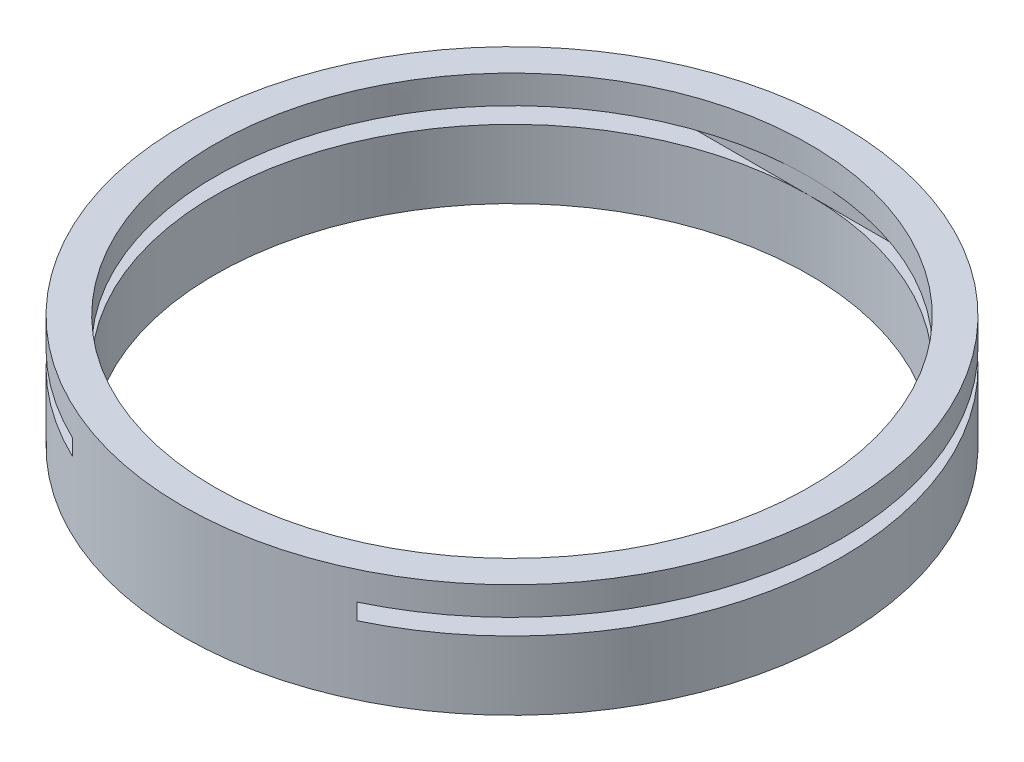
ISO-10303-21;
HEADER;
FILE_DESCRIPTION(('STEP AP214'),'2;1');
FILE_NAME('part.step','',(''),(''),'','','');
FILE_SCHEMA(('AUTOMOTIVE_DESIGN { 1 0 10303 214 1 1 1 1 }'));
ENDSEC;
DATA;
#1=APPLICATION_CONTEXT('core data for automotive mechanical design processes');
#2=APPLICATION_PROTOCOL_DEFINITION('international standard','automotive_design',2000,#1);
#3=PRODUCT_CONTEXT('',#1,'mechanical');
#4=PRODUCT('Part','Part','',(#3));
#5=PRODUCT_RELATED_PRODUCT_CATEGORY('part','',(#4));
#6=PRODUCT_DEFINITION_FORMATION('','',#4);
#7=PRODUCT_DEFINITION_CONTEXT('part definition',#1,'design');
#8=PRODUCT_DEFINITION('design','',#6,#7);
#9=PRODUCT_DEFINITION_SHAPE('','',#8);
#10=(LENGTH_UNIT() NAMED_UNIT(*) SI_UNIT(.MILLI.,.METRE.));
#11=(NAMED_UNIT(*) PLANE_ANGLE_UNIT() SI_UNIT($,.RADIAN.));
#12=(NAMED_UNIT(*) SI_UNIT($,.STERADIAN.) SOLID_ANGLE_UNIT());
#13=UNCERTAINTY_MEASURE_WITH_UNIT(LENGTH_MEASURE(1.E-05),#10,'distance_accuracy_value','');
#14=(GEOMETRIC_REPRESENTATION_CONTEXT(3) GLOBAL_UNCERTAINTY_ASSIGNED_CONTEXT((#13)) GLOBAL_UNIT_ASSIGNED_CONTEXT((#10,
#11,#12)) REPRESENTATION_CONTEXT('',''));
#15=CARTESIAN_POINT('',(0.,0.,0.));
#16=DIRECTION('',(0.,0.,1.));
#17=DIRECTION('',(1.,0.,0.));
#18=AXIS2_PLACEMENT_3D('',#15,#16,#17);
#19=CARTESIAN_POINT('',(0.,7.,0.));
#20=DIRECTION('',(0.,-1.,0.));
#21=DIRECTION('',(0.,0.,-1.));
#22=AXIS2_PLACEMENT_3D('',#19,#20,#21);
#23=CYLINDRICAL_SURFACE('',#22,20.4);
#24=CARTESIAN_POINT('',(0.,4.25,0.));
#25=DIRECTION('',(0.,1.,0.));
#26=DIRECTION('',(0.,0.,1.));
#27=AXIS2_PLACEMENT_3D('',#24,#25,#26);
#28=CIRCLE('',#27,20.4);
#29=CARTESIAN_POINT('',(8.8090862182181,4.25,18.4));
#30=VERTEX_POINT('',#29);
#31=CARTESIAN_POINT('',(8.8090862182181,4.25,-18.4));
#32=VERTEX_POINT('',#31);
#33=EDGE_CURVE('E142',#30,#32,#28,.T.);
#34=ORIENTED_EDGE('',*,*,#33,.F.);
#35=DIRECTION('',(0.,-1.,0.));
#36=VECTOR('',#35,1.);
#37=CARTESIAN_POINT('',(8.80908621821809,7.,18.4));
#38=LINE('',#37,#36);
#39=CARTESIAN_POINT('',(8.80908621821809,5.25,18.4));
#40=VERTEX_POINT('',#39);
#41=EDGE_CURVE('E160',#30,#40,#38,.F.);
#42=ORIENTED_EDGE('',*,*,#41,.T.);
#43=CARTESIAN_POINT('',(0.,5.25,0.));
#44=DIRECTION('',(0.,1.,0.));
#45=DIRECTION('',(0.,0.,1.));
#46=AXIS2_PLACEMENT_3D('',#43,#44,#45);
#47=CIRCLE('',#46,20.4);
#48=CARTESIAN_POINT('',(8.8090862182181,5.25,-18.4));
#49=VERTEX_POINT('',#48);
#50=EDGE_CURVE('E121',#40,#49,#47,.T.);
#51=ORIENTED_EDGE('',*,*,#50,.T.);
#52=DIRECTION('',(0.,-1.,0.));
#53=VECTOR('',#52,1.);
#54=CARTESIAN_POINT('',(8.8090862182181,7.,-18.4));
#55=LINE('',#54,#53);
#56=EDGE_CURVE('E152',#32,#49,#55,.F.);
#57=ORIENTED_EDGE('',*,*,#56,.F.);
#58=EDGE_LOOP('',(#34,#42,#51,#57));
#59=FACE_BOUND('',#58,.T.);
#60=CARTESIAN_POINT('',(0.,7.,0.));
#61=DIRECTION('',(0.,1.,0.));
#62=DIRECTION('',(0.,0.,1.));
#63=AXIS2_PLACEMENT_3D('',#60,#61,#62);
#64=CIRCLE('',#63,20.4);
#65=CARTESIAN_POINT('',(0.,7.,20.4));
#66=VERTEX_POINT('',#65);
#67=EDGE_CURVE('E110',#66,#66,#64,.T.);
#68=ORIENTED_EDGE('',*,*,#67,.F.);
#69=EDGE_LOOP('',(#68));
#70=FACE_BOUND('',#69,.T.);
#71=CARTESIAN_POINT('',(0.,0.,0.));
#72=DIRECTION('',(0.,1.,0.));
#73=DIRECTION('',(0.,0.,1.));
#74=AXIS2_PLACEMENT_3D('',#71,#72,#73);
#75=CIRCLE('',#74,20.4);
#76=CARTESIAN_POINT('',(0.,0.,20.4));
#77=VERTEX_POINT('',#76);
#78=EDGE_CURVE('E130',#77,#77,#75,.T.);
#79=ORIENTED_EDGE('',*,*,#78,.T.);
#80=EDGE_LOOP('',(#79));
#81=FACE_BOUND('',#80,.T.);
#82=CARTESIAN_POINT('',(-8.8090862182181,4.25,-18.4));
#83=VERTEX_POINT('',#82);
#84=CARTESIAN_POINT('',(-8.80908621821809,4.25,18.4));
#85=VERTEX_POINT('',#84);
#86=EDGE_CURVE('E146',#83,#85,#28,.T.);
#87=ORIENTED_EDGE('',*,*,#86,.F.);
#88=DIRECTION('',(0.,-1.,0.));
#89=VECTOR('',#88,1.);
#90=CARTESIAN_POINT('',(-8.8090862182181,7.,-18.4));
#91=LINE('',#90,#89);
#92=CARTESIAN_POINT('',(-8.8090862182181,5.25,-18.4));
#93=VERTEX_POINT('',#92);
#94=EDGE_CURVE('E149',#93,#83,#91,.T.);
#95=ORIENTED_EDGE('',*,*,#94,.F.);
#96=CARTESIAN_POINT('',(-8.8090862182181,5.25,18.4));
#97=VERTEX_POINT('',#96);
#98=EDGE_CURVE('E155',#93,#97,#47,.T.);
#99=ORIENTED_EDGE('',*,*,#98,.T.);
#100=DIRECTION('',(0.,-1.,0.));
#101=VECTOR('',#100,1.);
#102=CARTESIAN_POINT('',(-8.80908621821809,7.,18.4));
#103=LINE('',#102,#101);
#104=EDGE_CURVE('E113',#97,#85,#103,.T.);
#105=ORIENTED_EDGE('',*,*,#104,.T.);
#106=EDGE_LOOP('',(#87,#95,#99,#105));
#107=FACE_BOUND('',#106,.T.);
#108=ADVANCED_FACE('F45',(#59,#70,#81,#107),#23,.T.);
#109=CARTESIAN_POINT('',(0.,7.,0.));
#110=DIRECTION('',(0.,-1.,0.));
#111=DIRECTION('',(0.,0.,-1.));
#112=AXIS2_PLACEMENT_3D('',#109,#110,#111);
#113=CYLINDRICAL_SURFACE('',#112,18.4);
#114=CARTESIAN_POINT('',(0.,0.,0.));
#115=DIRECTION('',(0.,1.,0.));
#116=DIRECTION('',(0.,0.,1.));
#117=AXIS2_PLACEMENT_3D('',#114,#115,#116);
#118=CIRCLE('',#117,18.4);
#119=CARTESIAN_POINT('',(0.,0.,18.4));
#120=VERTEX_POINT('',#119);
#121=EDGE_CURVE('E138',#120,#120,#118,.T.);
#122=ORIENTED_EDGE('',*,*,#121,.F.);
#123=EDGE_LOOP('',(#122));
#124=FACE_BOUND('',#123,.T.);
#125=CARTESIAN_POINT('',(0.,4.25,0.));
#126=DIRECTION('',(0.,1.,0.));
#127=DIRECTION('',(0.,0.,1.));
#128=AXIS2_PLACEMENT_3D('',#125,#126,#127);
#129=CIRCLE('',#128,18.4);
#130=CARTESIAN_POINT('',(0.,4.25,-18.4));
#131=VERTEX_POINT('',#130);
#132=CARTESIAN_POINT('',(0.,4.25,18.4));
#133=VERTEX_POINT('',#132);
#134=EDGE_CURVE('E48',#131,#133,#129,.T.);
#135=ORIENTED_EDGE('',*,*,#134,.T.);
#136=EDGE_CURVE('E11',#133,#131,#129,.T.);
#137=ORIENTED_EDGE('',*,*,#136,.T.);
#138=EDGE_LOOP('',(#135,#137));
#139=FACE_BOUND('',#138,.T.);
#140=ADVANCED_FACE('F185',(#124,#139),#113,.F.);
#141=CARTESIAN_POINT('',(0.,7.,0.));
#142=DIRECTION('',(0.,1.,0.));
#143=DIRECTION('',(0.,0.,1.));
#144=AXIS2_PLACEMENT_3D('',#141,#142,#143);
#145=PLANE('',#144);
#146=ORIENTED_EDGE('',*,*,#67,.T.);
#147=EDGE_LOOP('',(#146));
#148=FACE_BOUND('',#147,.T.);
#149=CARTESIAN_POINT('',(0.,7.,0.));
#150=DIRECTION('',(0.,1.,0.));
#151=DIRECTION('',(0.,0.,1.));
#152=AXIS2_PLACEMENT_3D('',#149,#150,#151);
#153=CIRCLE('',#152,18.4);
#154=CARTESIAN_POINT('',(0.,7.,18.4));
#155=VERTEX_POINT('',#154);
#156=EDGE_CURVE('E134',#155,#155,#153,.T.);
#157=ORIENTED_EDGE('',*,*,#156,.F.);
#158=EDGE_LOOP('',(#157));
#159=FACE_BOUND('',#158,.T.);
#160=ADVANCED_FACE('F187',(#148,#159),#145,.T.);
#161=CARTESIAN_POINT('',(0.,0.,0.));
#162=DIRECTION('',(0.,1.,0.));
#163=DIRECTION('',(0.,0.,1.));
#164=AXIS2_PLACEMENT_3D('',#161,#162,#163);
#165=PLANE('',#164);
#166=ORIENTED_EDGE('',*,*,#78,.F.);
#167=EDGE_LOOP('',(#166));
#168=FACE_BOUND('',#167,.T.);
#169=ORIENTED_EDGE('',*,*,#121,.T.);
#170=EDGE_LOOP('',(#169));
#171=FACE_BOUND('',#170,.T.);
#172=ADVANCED_FACE('F195',(#168,#171),#165,.F.);
#173=CARTESIAN_POINT('',(0.,5.25,0.));
#174=DIRECTION('',(0.,1.,0.));
#175=DIRECTION('',(0.,0.,1.));
#176=AXIS2_PLACEMENT_3D('',#173,#174,#175);
#177=CIRCLE('',#176,18.4);
#178=CARTESIAN_POINT('',(0.,5.25,18.4));
#179=VERTEX_POINT('',#178);
#180=CARTESIAN_POINT('',(0.,5.25,-18.4));
#181=VERTEX_POINT('',#180);
#182=EDGE_CURVE('E109',#179,#181,#177,.T.);
#183=ORIENTED_EDGE('',*,*,#182,.F.);
#184=EDGE_CURVE('E99',#181,#179,#177,.T.);
#185=ORIENTED_EDGE('',*,*,#184,.F.);
#186=EDGE_LOOP('',(#183,#185));
#187=FACE_BOUND('',#186,.T.);
#188=ORIENTED_EDGE('',*,*,#156,.T.);
#189=EDGE_LOOP('',(#188));
#190=FACE_BOUND('',#189,.T.);
#191=ADVANCED_FACE('F124',(#187,#190),#113,.F.);
#192=CARTESIAN_POINT('',(31.,4.25,18.4));
#193=DIRECTION('',(0.,1.,0.));
#194=DIRECTION('',(0.,0.,1.));
#195=AXIS2_PLACEMENT_3D('',#192,#193,#194);
#196=PLANE('',#195);
#197=ORIENTED_EDGE('',*,*,#33,.T.);
#198=DIRECTION('',(-1.,0.,0.));
#199=VECTOR('',#198,1.);
#200=CARTESIAN_POINT('',(31.,4.25,-18.4));
#201=LINE('',#200,#199);
#202=EDGE_CURVE('E163',#32,#131,#201,.T.);
#203=ORIENTED_EDGE('',*,*,#202,.T.);
#204=ORIENTED_EDGE('',*,*,#136,.F.);
#205=DIRECTION('',(-1.,0.,0.));
#206=VECTOR('',#205,1.);
#207=CARTESIAN_POINT('',(31.,4.25,18.4));
#208=LINE('',#207,#206);
#209=EDGE_CURVE('E115',#30,#133,#208,.T.);
#210=ORIENTED_EDGE('',*,*,#209,.F.);
#211=EDGE_LOOP('',(#197,#203,#204,#210));
#212=FACE_BOUND('',#211,.T.);
#213=ADVANCED_FACE('F182',(#212),#196,.T.);
#214=ORIENTED_EDGE('',*,*,#86,.T.);
#215=EDGE_CURVE('E60',#133,#85,#208,.T.);
#216=ORIENTED_EDGE('',*,*,#215,.F.);
#217=ORIENTED_EDGE('',*,*,#134,.F.);
#218=EDGE_CURVE('E164',#131,#83,#201,.T.);
#219=ORIENTED_EDGE('',*,*,#218,.T.);
#220=EDGE_LOOP('',(#214,#216,#217,#219));
#221=FACE_BOUND('',#220,.T.);
#222=ADVANCED_FACE('F178',(#221),#196,.T.);
#223=CARTESIAN_POINT('',(31.,4.25,-18.4));
#224=DIRECTION('',(0.,0.,1.));
#225=DIRECTION('',(1.,0.,0.));
#226=AXIS2_PLACEMENT_3D('',#223,#224,#225);
#227=PLANE('',#226);
#228=ORIENTED_EDGE('',*,*,#94,.T.);
#229=ORIENTED_EDGE('',*,*,#218,.F.);
#230=ORIENTED_EDGE('',*,*,#202,.F.);
#231=ORIENTED_EDGE('',*,*,#56,.T.);
#232=DIRECTION('',(-1.,0.,0.));
#233=VECTOR('',#232,1.);
#234=CARTESIAN_POINT('',(31.,5.25,-18.4));
#235=LINE('',#234,#233);
#236=EDGE_CURVE('E168',#49,#181,#235,.T.);
#237=ORIENTED_EDGE('',*,*,#236,.T.);
#238=EDGE_CURVE('E104',#181,#93,#235,.T.);
#239=ORIENTED_EDGE('',*,*,#238,.T.);
#240=EDGE_LOOP('',(#228,#229,#230,#231,#237,#239));
#241=FACE_BOUND('',#240,.T.);
#242=ADVANCED_FACE('F214',(#241),#227,.T.);
#243=CARTESIAN_POINT('',(31.,5.25,18.4));
#244=DIRECTION('',(0.,1.,0.));
#245=DIRECTION('',(0.,0.,1.));
#246=AXIS2_PLACEMENT_3D('',#243,#244,#245);
#247=PLANE('',#246);
#248=DIRECTION('',(-1.,0.,0.));
#249=VECTOR('',#248,1.);
#250=CARTESIAN_POINT('',(31.,5.25,18.4));
#251=LINE('',#250,#249);
#252=EDGE_CURVE('E67',#40,#179,#251,.T.);
#253=ORIENTED_EDGE('',*,*,#252,.T.);
#254=ORIENTED_EDGE('',*,*,#182,.T.);
#255=ORIENTED_EDGE('',*,*,#236,.F.);
#256=ORIENTED_EDGE('',*,*,#50,.F.);
#257=EDGE_LOOP('',(#253,#254,#255,#256));
#258=FACE_BOUND('',#257,.T.);
#259=ADVANCED_FACE('F118',(#258),#247,.F.);
#260=ORIENTED_EDGE('',*,*,#238,.F.);
#261=ORIENTED_EDGE('',*,*,#184,.T.);
#262=EDGE_CURVE('E101',#179,#97,#251,.T.);
#263=ORIENTED_EDGE('',*,*,#262,.T.);
#264=ORIENTED_EDGE('',*,*,#98,.F.);
#265=EDGE_LOOP('',(#260,#261,#263,#264));
#266=FACE_BOUND('',#265,.T.);
#267=ADVANCED_FACE('F100',(#266),#247,.F.);
#268=CARTESIAN_POINT('',(31.,4.25,18.4));
#269=DIRECTION('',(0.,0.,1.));
#270=DIRECTION('',(1.,0.,0.));
#271=AXIS2_PLACEMENT_3D('',#268,#269,#270);
#272=PLANE('',#271);
#273=ORIENTED_EDGE('',*,*,#262,.F.);
#274=ORIENTED_EDGE('',*,*,#252,.F.);
#275=ORIENTED_EDGE('',*,*,#41,.F.);
#276=ORIENTED_EDGE('',*,*,#209,.T.);
#277=ORIENTED_EDGE('',*,*,#215,.T.);
#278=ORIENTED_EDGE('',*,*,#104,.F.);
#279=EDGE_LOOP('',(#273,#274,#275,#276,#277,#278));
#280=FACE_BOUND('',#279,.T.);
#281=ADVANCED_FACE('F111',(#280),#272,.F.);
#282=CLOSED_SHELL('',(#108,#140,#160,#172,#191,#213,#222,#242,#259,#267,#281));
#283=MANIFOLD_SOLID_BREP('B2',#282);
#284=ADVANCED_BREP_SHAPE_REPRESENTATION('',(#18,#283),#14);
#285=SHAPE_DEFINITION_REPRESENTATION(#9,#284);
ENDSEC;
END-ISO-10303-21;
